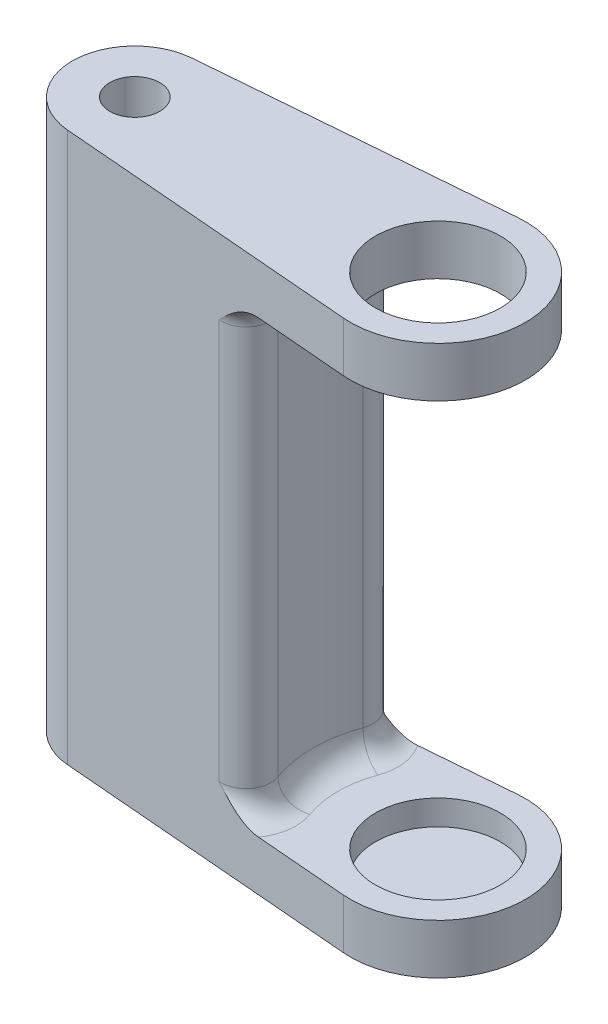
ISO-10303-21;
HEADER;
FILE_DESCRIPTION(('STEP AP214'),'2;1');
FILE_NAME('part.step','',(''),(''),'','','');
FILE_SCHEMA(('AUTOMOTIVE_DESIGN { 1 0 10303 214 1 1 1 1 }'));
ENDSEC;
DATA;
#1=APPLICATION_CONTEXT('core data for automotive mechanical design processes');
#2=APPLICATION_PROTOCOL_DEFINITION('international standard','automotive_design',2000,#1);
#3=PRODUCT_CONTEXT('',#1,'mechanical');
#4=PRODUCT('Part','Part','',(#3));
#5=PRODUCT_RELATED_PRODUCT_CATEGORY('part','',(#4));
#6=PRODUCT_DEFINITION_FORMATION('','',#4);
#7=PRODUCT_DEFINITION_CONTEXT('part definition',#1,'design');
#8=PRODUCT_DEFINITION('design','',#6,#7);
#9=PRODUCT_DEFINITION_SHAPE('','',#8);
#10=(LENGTH_UNIT() NAMED_UNIT(*) SI_UNIT(.MILLI.,.METRE.));
#11=(NAMED_UNIT(*) PLANE_ANGLE_UNIT() SI_UNIT($,.RADIAN.));
#12=(NAMED_UNIT(*) SI_UNIT($,.STERADIAN.) SOLID_ANGLE_UNIT());
#13=UNCERTAINTY_MEASURE_WITH_UNIT(LENGTH_MEASURE(1.E-05),#10,'distance_accuracy_value','');
#14=(GEOMETRIC_REPRESENTATION_CONTEXT(3) GLOBAL_UNCERTAINTY_ASSIGNED_CONTEXT((#13)) GLOBAL_UNIT_ASSIGNED_CONTEXT((#10,
#11,#12)) REPRESENTATION_CONTEXT('',''));
#15=CARTESIAN_POINT('',(0.,0.,0.));
#16=DIRECTION('',(0.,0.,1.));
#17=DIRECTION('',(1.,0.,0.));
#18=AXIS2_PLACEMENT_3D('',#15,#16,#17);
#19=CARTESIAN_POINT('',(12.1339592918151,22.,0.));
#20=DIRECTION('',(0.,-1.,0.));
#21=DIRECTION('',(0.,0.,-1.));
#22=AXIS2_PLACEMENT_3D('',#19,#20,#21);
#23=CYLINDRICAL_SURFACE('',#22,5.);
#24=DIRECTION('',(0.,-1.,0.));
#25=VECTOR('',#24,1.);
#26=CARTESIAN_POINT('',(7.43243016758423,22.,-1.70165328254865));
#27=LINE('',#26,#25);
#28=CARTESIAN_POINT('',(7.43243016758423,3.,-1.70165328254865));
#29=VERTEX_POINT('',#28);
#30=CARTESIAN_POINT('',(7.43243016758423,19.,-1.70165328254865));
#31=VERTEX_POINT('',#30);
#32=EDGE_CURVE('E302',#29,#31,#27,.F.);
#33=ORIENTED_EDGE('',*,*,#32,.T.);
#34=CARTESIAN_POINT('',(12.1339592918151,19.,0.));
#35=DIRECTION('',(0.,1.,0.));
#36=DIRECTION('',(0.,0.,1.));
#37=AXIS2_PLACEMENT_3D('',#34,#35,#36);
#38=CIRCLE('',#37,5.);
#39=CARTESIAN_POINT('',(7.43243016758423,19.,1.70165328254865));
#40=VERTEX_POINT('',#39);
#41=EDGE_CURVE('E339',#31,#40,#38,.T.);
#42=ORIENTED_EDGE('',*,*,#41,.T.);
#43=DIRECTION('',(0.,-1.,0.));
#44=VECTOR('',#43,1.);
#45=CARTESIAN_POINT('',(7.43243016758423,22.,1.70165328254865));
#46=LINE('',#45,#44);
#47=CARTESIAN_POINT('',(7.43243016758423,3.,1.70165328254865));
#48=VERTEX_POINT('',#47);
#49=EDGE_CURVE('E298',#40,#48,#46,.T.);
#50=ORIENTED_EDGE('',*,*,#49,.T.);
#51=CARTESIAN_POINT('',(12.1339592918151,3.,0.));
#52=DIRECTION('',(0.,1.,0.));
#53=DIRECTION('',(0.,0.,1.));
#54=AXIS2_PLACEMENT_3D('',#51,#52,#53);
#55=CIRCLE('',#54,5.);
#56=EDGE_CURVE('E336',#48,#29,#55,.F.);
#57=ORIENTED_EDGE('',*,*,#56,.T.);
#58=EDGE_LOOP('',(#33,#42,#50,#57));
#59=FACE_BOUND('',#58,.T.);
#60=ADVANCED_FACE('F58',(#59),#23,.F.);
#61=CARTESIAN_POINT('',(0.,2.,0.));
#62=DIRECTION('',(0.,-1.,0.));
#63=DIRECTION('',(0.,0.,-1.));
#64=AXIS2_PLACEMENT_3D('',#61,#62,#63);
#65=CYLINDRICAL_SURFACE('',#64,2.5);
#66=CARTESIAN_POINT('',(0.,0.,0.));
#67=DIRECTION('',(0.,1.,0.));
#68=DIRECTION('',(0.,0.,1.));
#69=AXIS2_PLACEMENT_3D('',#66,#67,#68);
#70=CIRCLE('',#69,2.5);
#71=CARTESIAN_POINT('',(-0.206033326787766,0.,-2.49149558864806));
#72=VERTEX_POINT('',#71);
#73=CARTESIAN_POINT('',(-0.206033326787766,0.,2.49149558864806));
#74=VERTEX_POINT('',#73);
#75=EDGE_CURVE('E264',#72,#74,#70,.T.);
#76=ORIENTED_EDGE('',*,*,#75,.T.);
#77=DIRECTION('',(0.,-1.,0.));
#78=VECTOR('',#77,1.);
#79=CARTESIAN_POINT('',(-0.206033326787766,2.,2.49149558864806));
#80=LINE('',#79,#78);
#81=CARTESIAN_POINT('',(-0.206033326787766,22.,2.49149558864806));
#82=VERTEX_POINT('',#81);
#83=EDGE_CURVE('E287',#82,#74,#80,.T.);
#84=ORIENTED_EDGE('',*,*,#83,.F.);
#85=CARTESIAN_POINT('',(0.,22.,0.));
#86=DIRECTION('',(0.,1.,0.));
#87=DIRECTION('',(0.,0.,1.));
#88=AXIS2_PLACEMENT_3D('',#85,#86,#87);
#89=CIRCLE('',#88,2.5);
#90=CARTESIAN_POINT('',(-0.206033326787766,22.,-2.49149558864806));
#91=VERTEX_POINT('',#90);
#92=EDGE_CURVE('E235',#91,#82,#89,.T.);
#93=ORIENTED_EDGE('',*,*,#92,.F.);
#94=DIRECTION('',(0.,-1.,0.));
#95=VECTOR('',#94,1.);
#96=CARTESIAN_POINT('',(-0.206033326787766,2.,-2.49149558864806));
#97=LINE('',#96,#95);
#98=EDGE_CURVE('E260',#91,#72,#97,.T.);
#99=ORIENTED_EDGE('',*,*,#98,.T.);
#100=EDGE_LOOP('',(#76,#84,#93,#99));
#101=FACE_BOUND('',#100,.T.);
#102=ADVANCED_FACE('F436',(#101),#65,.T.);
#103=CARTESIAN_POINT('',(-0.206033326787766,2.,2.49149558864806));
#104=DIRECTION('',(0.0824133307151065,0.,-0.996598235459226));
#105=DIRECTION('',(-0.996598235459226,0.,-0.0824133307151065));
#106=AXIS2_PLACEMENT_3D('',#103,#104,#105);
#107=PLANE('',#106);
#108=DIRECTION('',(0.996598235459226,0.,0.0824133307151065));
#109=VECTOR('',#108,1.);
#110=CARTESIAN_POINT('',(-0.206033326787766,2.,2.49149558864806));
#111=LINE('',#110,#109);
#112=CARTESIAN_POINT('',(8.13586979057182,2.,3.18132625053715));
#113=VERTEX_POINT('',#112);
#114=CARTESIAN_POINT('',(11.8455126343123,2.,3.48809382410729));
#115=VERTEX_POINT('',#114);
#116=EDGE_CURVE('E245',#113,#115,#111,.T.);
#117=ORIENTED_EDGE('',*,*,#116,.F.);
#118=CARTESIAN_POINT('',(8.13586979057182,2.,3.18132625053715));
#119=CARTESIAN_POINT('',(8.09316004611418,1.99999719638696,3.17779438366291));
#120=CARTESIAN_POINT('',(8.05048704833025,2.00206602766505,3.17426555554156));
#121=CARTESIAN_POINT('',(7.96556480970233,2.01007196565002,3.16724294172579));
#122=CARTESIAN_POINT('',(7.92331502317035,2.0160031855693,3.16374911090589));
#123=CARTESIAN_POINT('',(7.79858346282737,2.03899489781274,3.1534344796258));
#124=CARTESIAN_POINT('',(7.71703318744452,2.06126812700595,3.14669070909129));
#125=CARTESIAN_POINT('',(7.52853373637891,2.12790134045867,3.13110281514611));
#126=CARTESIAN_POINT('',(7.42342780321444,2.17739633549622,3.12241111800899));
#127=CARTESIAN_POINT('',(7.22184830232367,2.29230484344285,3.10574157407322));
#128=CARTESIAN_POINT('',(7.12542626618065,2.35780578217832,3.09776798866022));
#129=CARTESIAN_POINT('',(6.92168221585325,2.51342065488198,3.08091944809148));
#130=CARTESIAN_POINT('',(6.81615446108684,2.60582936815586,3.07219286856951));
#131=CARTESIAN_POINT('',(6.61179359857422,2.797324032,3.05529332094016));
#132=CARTESIAN_POINT('',(6.51295532211854,2.89640470652048,3.04711992540821));
#133=CARTESIAN_POINT('',(6.41268229349297,2.9970185776462,3.03882788356437));
#134=CARTESIAN_POINT('',(6.4111966525313,2.99850928967796,3.03870502902225));
#135=CARTESIAN_POINT('',(6.40971101202295,3.,3.03858217451761));
#136=B_SPLINE_CURVE_WITH_KNOTS('',3,(#118,#119,#120,#121,#122,#123,#124,#125,#126,#127,#128,
#129,#130,#131,#132,#133,#134,#135),.UNSPECIFIED.,.F.,.F.,(4,2,2,2,2,2,2,2,4),(0.,
0.128456249212845,0.256717171023223,0.510014180776443,0.857583473002188,1.20709540467853,
1.62797108908916,2.04851777580517,2.05484233112552),.UNSPECIFIED.);
#137=CARTESIAN_POINT('',(6.40971101202295,3.,3.03858217451761));
#138=VERTEX_POINT('',#137);
#139=EDGE_CURVE('E69',#113,#138,#136,.T.);
#140=ORIENTED_EDGE('',*,*,#139,.T.);
#141=DIRECTION('',(0.,1.,0.));
#142=VECTOR('',#141,1.);
#143=CARTESIAN_POINT('',(6.40971101202295,20.,3.03858217451761));
#144=LINE('',#143,#142);
#145=CARTESIAN_POINT('',(6.40971101202295,19.,3.03858217451761));
#146=VERTEX_POINT('',#145);
#147=EDGE_CURVE('E306',#138,#146,#144,.T.);
#148=ORIENTED_EDGE('',*,*,#147,.T.);
#149=CARTESIAN_POINT('',(8.13586979057182,20.,3.18132625053715));
#150=CARTESIAN_POINT('',(8.0931600461142,20.000002803613,3.17779438366291));
#151=CARTESIAN_POINT('',(8.05048704833028,19.9979339723349,3.17426555554157));
#152=CARTESIAN_POINT('',(7.96556480970241,19.98992803435,3.1672429417258));
#153=CARTESIAN_POINT('',(7.92331502317044,19.9839968144307,3.1637491109059));
#154=CARTESIAN_POINT('',(7.79858346282744,19.9610051021873,3.1534344796258));
#155=CARTESIAN_POINT('',(7.71703318744456,19.9387318729941,3.14669070909129));
#156=CARTESIAN_POINT('',(7.52853373637888,19.8720986595413,3.13110281514611));
#157=CARTESIAN_POINT('',(7.42342780321437,19.8226036645038,3.12241111800898));
#158=CARTESIAN_POINT('',(7.22184830232363,19.7076951565571,3.10574157407322));
#159=CARTESIAN_POINT('',(7.12542626618068,19.6421942178216,3.09776798866022));
#160=CARTESIAN_POINT('',(6.92168221585319,19.4865793451181,3.08091944809148));
#161=CARTESIAN_POINT('',(6.81615446108657,19.3941706318444,3.0721928685695));
#162=CARTESIAN_POINT('',(6.61179359857452,19.2026759679997,3.05529332094018));
#163=CARTESIAN_POINT('',(6.51295532211961,19.1035952934785,3.0471199254083));
#164=CARTESIAN_POINT('',(6.41268229349299,19.0029814223538,3.03882788356437));
#165=CARTESIAN_POINT('',(6.41119665253131,19.001490710322,3.03870502902225));
#166=CARTESIAN_POINT('',(6.40971101202295,19.,3.03858217451761));
#167=B_SPLINE_CURVE_WITH_KNOTS('',3,(#149,#150,#151,#152,#153,#154,#155,#156,#157,#158,#159,
#160,#161,#162,#163,#164,#165,#166),.UNSPECIFIED.,.F.,.F.,(4,2,2,2,2,2,2,2,4),(0.,
0.12845624921279,0.256717171023112,0.510014180776443,0.857583473002278,1.20709540467853,
1.62797108908912,2.04851777580518,2.05484233112552),.UNSPECIFIED.);
#168=CARTESIAN_POINT('',(8.13586979057182,20.,3.18132625053715));
#169=VERTEX_POINT('',#168);
#170=EDGE_CURVE('E210',#146,#169,#167,.F.);
#171=ORIENTED_EDGE('',*,*,#170,.T.);
#172=DIRECTION('',(-0.996598235459226,0.,-0.0824133307151065));
#173=VECTOR('',#172,1.);
#174=CARTESIAN_POINT('',(-0.206033326787766,20.,2.49149558864806));
#175=LINE('',#174,#173);
#176=CARTESIAN_POINT('',(11.8455126343123,20.,3.48809382410729));
#177=VERTEX_POINT('',#176);
#178=EDGE_CURVE('E205',#177,#169,#175,.T.);
#179=ORIENTED_EDGE('',*,*,#178,.F.);
#180=DIRECTION('',(0.,1.,0.));
#181=VECTOR('',#180,1.);
#182=CARTESIAN_POINT('',(11.8455126343123,20.,3.48809382410729));
#183=LINE('',#182,#181);
#184=CARTESIAN_POINT('',(11.8455126343123,22.,3.48809382410729));
#185=VERTEX_POINT('',#184);
#186=EDGE_CURVE('E189',#177,#185,#183,.T.);
#187=ORIENTED_EDGE('',*,*,#186,.T.);
#188=DIRECTION('',(0.996598235459226,0.,0.0824133307151065));
#189=VECTOR('',#188,1.);
#190=CARTESIAN_POINT('',(-0.206033326787766,22.,2.49149558864806));
#191=LINE('',#190,#189);
#192=EDGE_CURVE('E239',#82,#185,#191,.T.);
#193=ORIENTED_EDGE('',*,*,#192,.F.);
#194=ORIENTED_EDGE('',*,*,#83,.T.);
#195=DIRECTION('',(0.996598235459226,0.,0.0824133307151065));
#196=VECTOR('',#195,1.);
#197=CARTESIAN_POINT('',(-0.206033326787766,0.,2.49149558864806));
#198=LINE('',#197,#196);
#199=CARTESIAN_POINT('',(11.8455126343123,0.,3.48809382410729));
#200=VERTEX_POINT('',#199);
#201=EDGE_CURVE('E268',#74,#200,#198,.T.);
#202=ORIENTED_EDGE('',*,*,#201,.T.);
#203=DIRECTION('',(0.,-1.,0.));
#204=VECTOR('',#203,1.);
#205=CARTESIAN_POINT('',(11.8455126343123,2.,3.48809382410729));
#206=LINE('',#205,#204);
#207=EDGE_CURVE('E283',#115,#200,#206,.T.);
#208=ORIENTED_EDGE('',*,*,#207,.F.);
#209=EDGE_LOOP('',(#117,#140,#148,#171,#179,#187,#193,#194,#202,#208));
#210=FACE_BOUND('',#209,.T.);
#211=ADVANCED_FACE('F207',(#210),#107,.F.);
#212=CARTESIAN_POINT('',(12.1339592918151,2.,0.));
#213=DIRECTION('',(0.,-1.,0.));
#214=DIRECTION('',(0.,0.,-1.));
#215=AXIS2_PLACEMENT_3D('',#212,#213,#214);
#216=CYLINDRICAL_SURFACE('',#215,3.5);
#217=CARTESIAN_POINT('',(12.1339592918151,0.,0.));
#218=DIRECTION('',(0.,1.,0.));
#219=DIRECTION('',(0.,0.,1.));
#220=AXIS2_PLACEMENT_3D('',#217,#218,#219);
#221=CIRCLE('',#220,3.5);
#222=CARTESIAN_POINT('',(11.8455126343123,0.,-3.48809382410729));
#223=VERTEX_POINT('',#222);
#224=EDGE_CURVE('E271',#200,#223,#221,.T.);
#225=ORIENTED_EDGE('',*,*,#224,.T.);
#226=DIRECTION('',(0.,-1.,0.));
#227=VECTOR('',#226,1.);
#228=CARTESIAN_POINT('',(11.8455126343123,2.,-3.48809382410729));
#229=LINE('',#228,#227);
#230=CARTESIAN_POINT('',(11.8455126343123,2.,-3.48809382410729));
#231=VERTEX_POINT('',#230);
#232=EDGE_CURVE('E279',#231,#223,#229,.T.);
#233=ORIENTED_EDGE('',*,*,#232,.F.);
#234=CARTESIAN_POINT('',(12.1339592918151,2.,0.));
#235=DIRECTION('',(0.,1.,0.));
#236=DIRECTION('',(0.,0.,1.));
#237=AXIS2_PLACEMENT_3D('',#234,#235,#236);
#238=CIRCLE('',#237,3.5);
#239=EDGE_CURVE('E248',#115,#231,#238,.T.);
#240=ORIENTED_EDGE('',*,*,#239,.F.);
#241=ORIENTED_EDGE('',*,*,#207,.T.);
#242=EDGE_LOOP('',(#225,#233,#240,#241));
#243=FACE_BOUND('',#242,.T.);
#244=ADVANCED_FACE('F368',(#243),#216,.T.);
#245=CARTESIAN_POINT('',(-0.206033326787766,2.,-2.49149558864806));
#246=DIRECTION('',(-0.0824133307151065,0.,-0.996598235459226));
#247=DIRECTION('',(-0.996598235459226,0.,0.0824133307151065));
#248=AXIS2_PLACEMENT_3D('',#245,#246,#247);
#249=PLANE('',#248);
#250=DIRECTION('',(-0.996598235459226,0.,0.0824133307151065));
#251=VECTOR('',#250,1.);
#252=CARTESIAN_POINT('',(-0.206033326787766,20.,-2.49149558864806));
#253=LINE('',#252,#251);
#254=CARTESIAN_POINT('',(11.8455126343123,20.,-3.48809382410729));
#255=VERTEX_POINT('',#254);
#256=CARTESIAN_POINT('',(8.13586979057182,20.,-3.18132625053715));
#257=VERTEX_POINT('',#256);
#258=EDGE_CURVE('E202',#255,#257,#253,.T.);
#259=ORIENTED_EDGE('',*,*,#258,.T.);
#260=CARTESIAN_POINT('',(8.13586979057182,20.,-3.18132625053715));
#261=CARTESIAN_POINT('',(8.0931600461142,20.000002803613,-3.17779438366291));
#262=CARTESIAN_POINT('',(8.05048704833028,19.9979339723349,-3.17426555554157));
#263=CARTESIAN_POINT('',(7.96556480970241,19.98992803435,-3.1672429417258));
#264=CARTESIAN_POINT('',(7.92331502317044,19.9839968144307,-3.1637491109059));
#265=CARTESIAN_POINT('',(7.79858346282744,19.9610051021873,-3.1534344796258));
#266=CARTESIAN_POINT('',(7.71703318744456,19.9387318729941,-3.14669070909129));
#267=CARTESIAN_POINT('',(7.52853373637888,19.8720986595413,-3.13110281514611));
#268=CARTESIAN_POINT('',(7.42342780321437,19.8226036645038,-3.12241111800898));
#269=CARTESIAN_POINT('',(7.22184830232363,19.7076951565571,-3.10574157407322));
#270=CARTESIAN_POINT('',(7.12542626618068,19.6421942178216,-3.09776798866022));
#271=CARTESIAN_POINT('',(6.92168221585319,19.4865793451181,-3.08091944809148));
#272=CARTESIAN_POINT('',(6.81615446108657,19.3941706318444,-3.0721928685695));
#273=CARTESIAN_POINT('',(6.61179359857452,19.2026759679997,-3.05529332094018));
#274=CARTESIAN_POINT('',(6.51295532211961,19.1035952934785,-3.0471199254083));
#275=CARTESIAN_POINT('',(6.41268229349299,19.0029814223538,-3.03882788356437));
#276=CARTESIAN_POINT('',(6.41119665253131,19.001490710322,-3.03870502902225));
#277=CARTESIAN_POINT('',(6.40971101202295,19.,-3.03858217451761));
#278=B_SPLINE_CURVE_WITH_KNOTS('',3,(#260,#261,#262,#263,#264,#265,#266,#267,#268,#269,#270,
#271,#272,#273,#274,#275,#276,#277),.UNSPECIFIED.,.F.,.F.,(4,2,2,2,2,2,2,2,4),(0.,
0.12845624921279,0.256717171023112,0.510014180776443,0.857583473002278,1.20709540467853,
1.62797108908912,2.04851777580518,2.05484233112552),.UNSPECIFIED.);
#279=CARTESIAN_POINT('',(6.40971101202295,19.,-3.03858217451761));
#280=VERTEX_POINT('',#279);
#281=EDGE_CURVE('E342',#257,#280,#278,.T.);
#282=ORIENTED_EDGE('',*,*,#281,.T.);
#283=DIRECTION('',(0.,-1.,0.));
#284=VECTOR('',#283,1.);
#285=CARTESIAN_POINT('',(6.40971101202295,2.,-3.03858217451761));
#286=LINE('',#285,#284);
#287=CARTESIAN_POINT('',(6.40971101202295,3.,-3.03858217451761));
#288=VERTEX_POINT('',#287);
#289=EDGE_CURVE('E294',#280,#288,#286,.T.);
#290=ORIENTED_EDGE('',*,*,#289,.T.);
#291=CARTESIAN_POINT('',(8.13586979057182,2.,-3.18132625053715));
#292=CARTESIAN_POINT('',(8.09316004611418,1.99999719638696,-3.17779438366291));
#293=CARTESIAN_POINT('',(8.05048704833025,2.00206602766505,-3.17426555554156));
#294=CARTESIAN_POINT('',(7.96556480970233,2.01007196565002,-3.16724294172579));
#295=CARTESIAN_POINT('',(7.92331502317035,2.0160031855693,-3.16374911090589));
#296=CARTESIAN_POINT('',(7.79858346282737,2.03899489781274,-3.1534344796258));
#297=CARTESIAN_POINT('',(7.71703318744452,2.06126812700595,-3.14669070909129));
#298=CARTESIAN_POINT('',(7.52853373637891,2.12790134045867,-3.13110281514611));
#299=CARTESIAN_POINT('',(7.42342780321444,2.17739633549622,-3.12241111800899));
#300=CARTESIAN_POINT('',(7.22184830232367,2.29230484344285,-3.10574157407322));
#301=CARTESIAN_POINT('',(7.12542626618065,2.35780578217832,-3.09776798866022));
#302=CARTESIAN_POINT('',(6.92168221585325,2.51342065488198,-3.08091944809148));
#303=CARTESIAN_POINT('',(6.81615446108684,2.60582936815586,-3.07219286856951));
#304=CARTESIAN_POINT('',(6.61179359857422,2.797324032,-3.05529332094016));
#305=CARTESIAN_POINT('',(6.51295532211854,2.89640470652048,-3.04711992540821));
#306=CARTESIAN_POINT('',(6.41268229349297,2.9970185776462,-3.03882788356437));
#307=CARTESIAN_POINT('',(6.4111966525313,2.99850928967796,-3.03870502902225));
#308=CARTESIAN_POINT('',(6.40971101202295,3.,-3.03858217451761));
#309=B_SPLINE_CURVE_WITH_KNOTS('',3,(#291,#292,#293,#294,#295,#296,#297,#298,#299,#300,#301,
#302,#303,#304,#305,#306,#307,#308),.UNSPECIFIED.,.F.,.F.,(4,2,2,2,2,2,2,2,4),(0.,
0.128456249212845,0.256717171023223,0.510014180776443,0.857583473002188,1.20709540467853,
1.62797108908916,2.04851777580517,2.05484233112552),.UNSPECIFIED.);
#310=CARTESIAN_POINT('',(8.13586979057182,2.,-3.18132625053715));
#311=VERTEX_POINT('',#310);
#312=EDGE_CURVE('E12',#288,#311,#309,.F.);
#313=ORIENTED_EDGE('',*,*,#312,.T.);
#314=DIRECTION('',(0.996598235459226,0.,-0.0824133307151065));
#315=VECTOR('',#314,1.);
#316=CARTESIAN_POINT('',(-0.206033326787766,2.,-2.49149558864806));
#317=LINE('',#316,#315);
#318=EDGE_CURVE('E253',#311,#231,#317,.T.);
#319=ORIENTED_EDGE('',*,*,#318,.T.);
#320=ORIENTED_EDGE('',*,*,#232,.T.);
#321=DIRECTION('',(0.996598235459226,0.,-0.0824133307151065));
#322=VECTOR('',#321,1.);
#323=CARTESIAN_POINT('',(-0.206033326787766,0.,-2.49149558864806));
#324=LINE('',#323,#322);
#325=EDGE_CURVE('E249',#72,#223,#324,.T.);
#326=ORIENTED_EDGE('',*,*,#325,.F.);
#327=ORIENTED_EDGE('',*,*,#98,.F.);
#328=DIRECTION('',(0.996598235459226,0.,-0.0824133307151065));
#329=VECTOR('',#328,1.);
#330=CARTESIAN_POINT('',(-0.206033326787766,22.,-2.49149558864806));
#331=LINE('',#330,#329);
#332=CARTESIAN_POINT('',(11.8455126343123,22.,-3.48809382410729));
#333=VERTEX_POINT('',#332);
#334=EDGE_CURVE('E241',#91,#333,#331,.T.);
#335=ORIENTED_EDGE('',*,*,#334,.T.);
#336=DIRECTION('',(0.,1.,0.));
#337=VECTOR('',#336,1.);
#338=CARTESIAN_POINT('',(11.8455126343123,20.,-3.48809382410729));
#339=LINE('',#338,#337);
#340=EDGE_CURVE('E201',#255,#333,#339,.T.);
#341=ORIENTED_EDGE('',*,*,#340,.F.);
#342=EDGE_LOOP('',(#259,#282,#290,#313,#319,#320,#326,#327,#335,#341));
#343=FACE_BOUND('',#342,.T.);
#344=ADVANCED_FACE('F362',(#343),#249,.T.);
#345=CARTESIAN_POINT('',(0.,2.,0.));
#346=DIRECTION('',(0.,-1.,0.));
#347=DIRECTION('',(0.,0.,-1.));
#348=AXIS2_PLACEMENT_3D('',#345,#346,#347);
#349=CYLINDRICAL_SURFACE('',#348,1.);
#350=CARTESIAN_POINT('',(0.,0.,0.));
#351=DIRECTION('',(0.,1.,0.));
#352=DIRECTION('',(0.,0.,1.));
#353=AXIS2_PLACEMENT_3D('',#350,#351,#352);
#354=CIRCLE('',#353,1.);
#355=CARTESIAN_POINT('',(0.,0.,1.));
#356=VERTEX_POINT('',#355);
#357=EDGE_CURVE('E244',#356,#356,#354,.T.);
#358=ORIENTED_EDGE('',*,*,#357,.F.);
#359=EDGE_LOOP('',(#358));
#360=FACE_BOUND('',#359,.T.);
#361=CARTESIAN_POINT('',(0.,22.,0.));
#362=DIRECTION('',(0.,1.,0.));
#363=DIRECTION('',(0.,0.,1.));
#364=AXIS2_PLACEMENT_3D('',#361,#362,#363);
#365=CIRCLE('',#364,1.);
#366=CARTESIAN_POINT('',(0.,22.,1.));
#367=VERTEX_POINT('',#366);
#368=EDGE_CURVE('E230',#367,#367,#365,.T.);
#369=ORIENTED_EDGE('',*,*,#368,.T.);
#370=EDGE_LOOP('',(#369));
#371=FACE_BOUND('',#370,.T.);
#372=ADVANCED_FACE('F367',(#360,#371),#349,.F.);
#373=CARTESIAN_POINT('',(12.1339592918151,2.,0.));
#374=DIRECTION('',(0.,-1.,0.));
#375=DIRECTION('',(0.,0.,-1.));
#376=AXIS2_PLACEMENT_3D('',#373,#374,#375);
#377=CYLINDRICAL_SURFACE('',#376,2.5);
#378=CARTESIAN_POINT('',(12.1339592918151,1.,0.));
#379=DIRECTION('',(0.,1.,0.));
#380=DIRECTION('',(0.,0.,1.));
#381=AXIS2_PLACEMENT_3D('',#378,#379,#380);
#382=CIRCLE('',#381,2.5);
#383=CARTESIAN_POINT('',(12.1339592918151,1.,2.5));
#384=VERTEX_POINT('',#383);
#385=EDGE_CURVE('E290',#384,#384,#382,.T.);
#386=ORIENTED_EDGE('',*,*,#385,.F.);
#387=EDGE_LOOP('',(#386));
#388=FACE_BOUND('',#387,.T.);
#389=CARTESIAN_POINT('',(12.1339592918151,2.,0.));
#390=DIRECTION('',(0.,1.,0.));
#391=DIRECTION('',(0.,0.,1.));
#392=AXIS2_PLACEMENT_3D('',#389,#390,#391);
#393=CIRCLE('',#392,2.5);
#394=CARTESIAN_POINT('',(12.1339592918151,2.,2.5));
#395=VERTEX_POINT('',#394);
#396=EDGE_CURVE('E256',#395,#395,#393,.T.);
#397=ORIENTED_EDGE('',*,*,#396,.T.);
#398=EDGE_LOOP('',(#397));
#399=FACE_BOUND('',#398,.T.);
#400=ADVANCED_FACE('F370',(#388,#399),#377,.F.);
#401=CARTESIAN_POINT('',(0.,2.,0.));
#402=DIRECTION('',(0.,1.,0.));
#403=DIRECTION('',(0.,0.,1.));
#404=AXIS2_PLACEMENT_3D('',#401,#402,#403);
#405=PLANE('',#404);
#406=CARTESIAN_POINT('',(12.1339592918151,2.,0.));
#407=DIRECTION('',(0.,1.,0.));
#408=DIRECTION('',(0.,0.,1.));
#409=AXIS2_PLACEMENT_3D('',#406,#407,#408);
#410=CIRCLE('',#409,4.);
#411=CARTESIAN_POINT('',(8.37273599243042,2.,-1.36132262603892));
#412=VERTEX_POINT('',#411);
#413=CARTESIAN_POINT('',(8.37273599243042,2.,1.36132262603892));
#414=VERTEX_POINT('',#413);
#415=EDGE_CURVE('E80',#412,#414,#410,.T.);
#416=ORIENTED_EDGE('',*,*,#415,.T.);
#417=CARTESIAN_POINT('',(6.49212434273806,2.,2.04198393905838));
#418=DIRECTION('',(0.,1.,0.));
#419=DIRECTION('',(0.,0.,1.));
#420=AXIS2_PLACEMENT_3D('',#417,#418,#419);
#421=CIRCLE('',#420,2.);
#422=EDGE_CURVE('E333',#414,#113,#421,.F.);
#423=ORIENTED_EDGE('',*,*,#422,.T.);
#424=ORIENTED_EDGE('',*,*,#116,.T.);
#425=ORIENTED_EDGE('',*,*,#239,.T.);
#426=ORIENTED_EDGE('',*,*,#318,.F.);
#427=CARTESIAN_POINT('',(6.49212434273806,2.,-2.04198393905838));
#428=DIRECTION('',(0.,1.,0.));
#429=DIRECTION('',(0.,0.,1.));
#430=AXIS2_PLACEMENT_3D('',#427,#428,#429);
#431=CIRCLE('',#430,2.);
#432=EDGE_CURVE('E86',#311,#412,#431,.F.);
#433=ORIENTED_EDGE('',*,*,#432,.T.);
#434=EDGE_LOOP('',(#416,#423,#424,#425,#426,#433));
#435=FACE_BOUND('',#434,.T.);
#436=ORIENTED_EDGE('',*,*,#396,.F.);
#437=EDGE_LOOP('',(#436));
#438=FACE_BOUND('',#437,.T.);
#439=ADVANCED_FACE('F449',(#435,#438),#405,.T.);
#440=CARTESIAN_POINT('',(0.,0.,0.));
#441=DIRECTION('',(0.,1.,0.));
#442=DIRECTION('',(0.,0.,1.));
#443=AXIS2_PLACEMENT_3D('',#440,#441,#442);
#444=PLANE('',#443);
#445=ORIENTED_EDGE('',*,*,#224,.F.);
#446=ORIENTED_EDGE('',*,*,#201,.F.);
#447=ORIENTED_EDGE('',*,*,#75,.F.);
#448=ORIENTED_EDGE('',*,*,#325,.T.);
#449=EDGE_LOOP('',(#445,#446,#447,#448));
#450=FACE_BOUND('',#449,.T.);
#451=ORIENTED_EDGE('',*,*,#357,.T.);
#452=EDGE_LOOP('',(#451));
#453=FACE_BOUND('',#452,.T.);
#454=ADVANCED_FACE('F451',(#450,#453),#444,.F.);
#455=CARTESIAN_POINT('',(0.,22.,0.));
#456=DIRECTION('',(0.,1.,0.));
#457=DIRECTION('',(0.,0.,1.));
#458=AXIS2_PLACEMENT_3D('',#455,#456,#457);
#459=PLANE('',#458);
#460=ORIENTED_EDGE('',*,*,#368,.F.);
#461=EDGE_LOOP('',(#460));
#462=FACE_BOUND('',#461,.T.);
#463=ORIENTED_EDGE('',*,*,#92,.T.);
#464=ORIENTED_EDGE('',*,*,#192,.T.);
#465=CARTESIAN_POINT('',(12.1339592918151,22.,0.));
#466=DIRECTION('',(0.,1.,0.));
#467=DIRECTION('',(0.,0.,1.));
#468=AXIS2_PLACEMENT_3D('',#465,#466,#467);
#469=CIRCLE('',#468,3.5);
#470=EDGE_CURVE('E197',#185,#333,#469,.T.);
#471=ORIENTED_EDGE('',*,*,#470,.T.);
#472=ORIENTED_EDGE('',*,*,#334,.F.);
#473=EDGE_LOOP('',(#463,#464,#471,#472));
#474=FACE_BOUND('',#473,.T.);
#475=CARTESIAN_POINT('',(12.1339592918151,22.,0.));
#476=DIRECTION('',(0.,1.,0.));
#477=DIRECTION('',(0.,0.,1.));
#478=AXIS2_PLACEMENT_3D('',#475,#476,#477);
#479=CIRCLE('',#478,2.5);
#480=CARTESIAN_POINT('',(12.1339592918151,22.,2.5));
#481=VERTEX_POINT('',#480);
#482=EDGE_CURVE('E390',#481,#481,#479,.T.);
#483=ORIENTED_EDGE('',*,*,#482,.F.);
#484=EDGE_LOOP('',(#483));
#485=FACE_BOUND('',#484,.T.);
#486=ADVANCED_FACE('F447',(#462,#474,#485),#459,.T.);
#487=CARTESIAN_POINT('',(12.1339592918151,20.,0.));
#488=DIRECTION('',(0.,1.,0.));
#489=DIRECTION('',(0.,0.,1.));
#490=AXIS2_PLACEMENT_3D('',#487,#488,#489);
#491=CYLINDRICAL_SURFACE('',#490,3.5);
#492=ORIENTED_EDGE('',*,*,#470,.F.);
#493=ORIENTED_EDGE('',*,*,#186,.F.);
#494=CARTESIAN_POINT('',(12.1339592918151,20.,0.));
#495=DIRECTION('',(0.,1.,0.));
#496=DIRECTION('',(0.,0.,1.));
#497=AXIS2_PLACEMENT_3D('',#494,#495,#496);
#498=CIRCLE('',#497,3.5);
#499=EDGE_CURVE('E194',#177,#255,#498,.T.);
#500=ORIENTED_EDGE('',*,*,#499,.T.);
#501=ORIENTED_EDGE('',*,*,#340,.T.);
#502=EDGE_LOOP('',(#492,#493,#500,#501));
#503=FACE_BOUND('',#502,.T.);
#504=ADVANCED_FACE('F191',(#503),#491,.T.);
#505=CARTESIAN_POINT('',(12.1339592918151,20.,0.));
#506=DIRECTION('',(0.,1.,0.));
#507=DIRECTION('',(0.,0.,1.));
#508=AXIS2_PLACEMENT_3D('',#505,#506,#507);
#509=PLANE('',#508);
#510=CARTESIAN_POINT('',(12.1339592918151,20.,0.));
#511=DIRECTION('',(0.,1.,0.));
#512=DIRECTION('',(0.,0.,1.));
#513=AXIS2_PLACEMENT_3D('',#510,#511,#512);
#514=CIRCLE('',#513,2.5);
#515=CARTESIAN_POINT('',(12.1339592918151,20.,2.5));
#516=VERTEX_POINT('',#515);
#517=EDGE_CURVE('E228',#516,#516,#514,.T.);
#518=ORIENTED_EDGE('',*,*,#517,.T.);
#519=EDGE_LOOP('',(#518));
#520=FACE_BOUND('',#519,.T.);
#521=CARTESIAN_POINT('',(12.1339592918151,20.,0.));
#522=DIRECTION('',(0.,1.,0.));
#523=DIRECTION('',(0.,0.,1.));
#524=AXIS2_PLACEMENT_3D('',#521,#522,#523);
#525=CIRCLE('',#524,4.);
#526=CARTESIAN_POINT('',(8.37273599243042,20.,1.36132262603892));
#527=VERTEX_POINT('',#526);
#528=CARTESIAN_POINT('',(8.37273599243042,20.,-1.36132262603892));
#529=VERTEX_POINT('',#528);
#530=EDGE_CURVE('E309',#527,#529,#525,.F.);
#531=ORIENTED_EDGE('',*,*,#530,.T.);
#532=CARTESIAN_POINT('',(6.49212434273806,20.,-2.04198393905838));
#533=DIRECTION('',(0.,1.,0.));
#534=DIRECTION('',(0.,0.,1.));
#535=AXIS2_PLACEMENT_3D('',#532,#533,#534);
#536=CIRCLE('',#535,2.);
#537=EDGE_CURVE('E315',#529,#257,#536,.T.);
#538=ORIENTED_EDGE('',*,*,#537,.T.);
#539=ORIENTED_EDGE('',*,*,#258,.F.);
#540=ORIENTED_EDGE('',*,*,#499,.F.);
#541=ORIENTED_EDGE('',*,*,#178,.T.);
#542=CARTESIAN_POINT('',(6.49212434273806,20.,2.04198393905838));
#543=DIRECTION('',(0.,1.,0.));
#544=DIRECTION('',(0.,0.,1.));
#545=AXIS2_PLACEMENT_3D('',#542,#543,#544);
#546=CIRCLE('',#545,2.);
#547=EDGE_CURVE('E312',#169,#527,#546,.T.);
#548=ORIENTED_EDGE('',*,*,#547,.T.);
#549=EDGE_LOOP('',(#531,#538,#539,#540,#541,#548));
#550=FACE_BOUND('',#549,.T.);
#551=ADVANCED_FACE('F215',(#520,#550),#509,.F.);
#552=CARTESIAN_POINT('',(12.1339592918151,20.,0.));
#553=DIRECTION('',(0.,1.,0.));
#554=DIRECTION('',(0.,0.,1.));
#555=AXIS2_PLACEMENT_3D('',#552,#553,#554);
#556=CYLINDRICAL_SURFACE('',#555,2.5);
#557=ORIENTED_EDGE('',*,*,#517,.F.);
#558=EDGE_LOOP('',(#557));
#559=FACE_BOUND('',#558,.T.);
#560=ORIENTED_EDGE('',*,*,#482,.T.);
#561=EDGE_LOOP('',(#560));
#562=FACE_BOUND('',#561,.T.);
#563=ADVANCED_FACE('F481',(#559,#562),#556,.F.);
#564=CARTESIAN_POINT('',(0.,1.,0.));
#565=DIRECTION('',(0.,1.,0.));
#566=DIRECTION('',(0.,0.,1.));
#567=AXIS2_PLACEMENT_3D('',#564,#565,#566);
#568=PLANE('',#567);
#569=ORIENTED_EDGE('',*,*,#385,.T.);
#570=EDGE_LOOP('',(#569));
#571=FACE_BOUND('',#570,.T.);
#572=ADVANCED_FACE('F483',(#571),#568,.T.);
#573=CARTESIAN_POINT('',(6.49212434273806,22.,-2.04198393905838));
#574=DIRECTION('',(0.,-1.,0.));
#575=DIRECTION('',(0.,0.,-1.));
#576=AXIS2_PLACEMENT_3D('',#573,#574,#575);
#577=CYLINDRICAL_SURFACE('',#576,1.);
#578=ORIENTED_EDGE('',*,*,#289,.F.);
#579=CARTESIAN_POINT('',(6.49212434273806,19.,-2.04198393905838));
#580=DIRECTION('',(0.,1.,0.));
#581=DIRECTION('',(0.,0.,1.));
#582=AXIS2_PLACEMENT_3D('',#579,#580,#581);
#583=CIRCLE('',#582,1.);
#584=EDGE_CURVE('E321',#280,#31,#583,.F.);
#585=ORIENTED_EDGE('',*,*,#584,.T.);
#586=ORIENTED_EDGE('',*,*,#32,.F.);
#587=CARTESIAN_POINT('',(6.49212434273806,3.,-2.04198393905838));
#588=DIRECTION('',(0.,1.,0.));
#589=DIRECTION('',(0.,0.,1.));
#590=AXIS2_PLACEMENT_3D('',#587,#588,#589);
#591=CIRCLE('',#590,1.);
#592=EDGE_CURVE('E318',#29,#288,#591,.T.);
#593=ORIENTED_EDGE('',*,*,#592,.T.);
#594=EDGE_LOOP('',(#578,#585,#586,#593));
#595=FACE_BOUND('',#594,.T.);
#596=ADVANCED_FACE('F409',(#595),#577,.T.);
#597=CARTESIAN_POINT('',(6.49212434273806,22.,2.04198393905838));
#598=DIRECTION('',(0.,-1.,0.));
#599=DIRECTION('',(0.,0.,-1.));
#600=AXIS2_PLACEMENT_3D('',#597,#598,#599);
#601=CYLINDRICAL_SURFACE('',#600,1.);
#602=ORIENTED_EDGE('',*,*,#49,.F.);
#603=CARTESIAN_POINT('',(6.49212434273806,19.,2.04198393905838));
#604=DIRECTION('',(0.,1.,0.));
#605=DIRECTION('',(0.,0.,1.));
#606=AXIS2_PLACEMENT_3D('',#603,#604,#605);
#607=CIRCLE('',#606,1.);
#608=EDGE_CURVE('E326',#40,#146,#607,.F.);
#609=ORIENTED_EDGE('',*,*,#608,.T.);
#610=ORIENTED_EDGE('',*,*,#147,.F.);
#611=CARTESIAN_POINT('',(6.49212434273806,3.,2.04198393905838));
#612=DIRECTION('',(0.,1.,0.));
#613=DIRECTION('',(0.,0.,1.));
#614=AXIS2_PLACEMENT_3D('',#611,#612,#613);
#615=CIRCLE('',#614,1.);
#616=EDGE_CURVE('E324',#138,#48,#615,.T.);
#617=ORIENTED_EDGE('',*,*,#616,.T.);
#618=EDGE_LOOP('',(#602,#609,#610,#617));
#619=FACE_BOUND('',#618,.T.);
#620=ADVANCED_FACE('F423',(#619),#601,.T.);
#621=CARTESIAN_POINT('',(6.49212434273806,19.,2.04198393905838));
#622=DIRECTION('',(0.,1.,0.));
#623=DIRECTION('',(0.,0.,1.));
#624=AXIS2_PLACEMENT_3D('',#621,#622,#623);
#625=TOROIDAL_SURFACE('',#624,2.,1.);
#626=ORIENTED_EDGE('',*,*,#170,.F.);
#627=ORIENTED_EDGE('',*,*,#608,.F.);
#628=CARTESIAN_POINT('',(8.37273599243042,19.,1.36132262603892));
#629=DIRECTION('',(0.340330656509731,0.,0.94030582484618));
#630=DIRECTION('',(0.940305824846181,0.,-0.340330656509731));
#631=AXIS2_PLACEMENT_3D('',#628,#629,#630);
#632=CIRCLE('',#631,1.);
#633=EDGE_CURVE('E387',#527,#40,#632,.T.);
#634=ORIENTED_EDGE('',*,*,#633,.F.);
#635=ORIENTED_EDGE('',*,*,#547,.F.);
#636=EDGE_LOOP('',(#626,#627,#634,#635));
#637=FACE_BOUND('',#636,.T.);
#638=ADVANCED_FACE('F426',(#637),#625,.F.);
#639=CARTESIAN_POINT('',(12.1339592918151,19.,0.));
#640=DIRECTION('',(0.,1.,0.));
#641=DIRECTION('',(0.,0.,1.));
#642=AXIS2_PLACEMENT_3D('',#639,#640,#641);
#643=TOROIDAL_SURFACE('',#642,4.,1.);
#644=ORIENTED_EDGE('',*,*,#633,.T.);
#645=ORIENTED_EDGE('',*,*,#41,.F.);
#646=CARTESIAN_POINT('',(8.37273599243042,19.,-1.36132262603892));
#647=DIRECTION('',(-0.340330656509731,0.,0.94030582484618));
#648=DIRECTION('',(0.940305824846181,0.,0.340330656509731));
#649=AXIS2_PLACEMENT_3D('',#646,#647,#648);
#650=CIRCLE('',#649,1.);
#651=EDGE_CURVE('E383',#529,#31,#650,.T.);
#652=ORIENTED_EDGE('',*,*,#651,.F.);
#653=ORIENTED_EDGE('',*,*,#530,.F.);
#654=EDGE_LOOP('',(#644,#645,#652,#653));
#655=FACE_BOUND('',#654,.T.);
#656=ADVANCED_FACE('F418',(#655),#643,.F.);
#657=CARTESIAN_POINT('',(6.49212434273806,19.,-2.04198393905838));
#658=DIRECTION('',(0.,1.,0.));
#659=DIRECTION('',(0.,0.,1.));
#660=AXIS2_PLACEMENT_3D('',#657,#658,#659);
#661=TOROIDAL_SURFACE('',#660,2.,1.);
#662=ORIENTED_EDGE('',*,*,#651,.T.);
#663=ORIENTED_EDGE('',*,*,#584,.F.);
#664=ORIENTED_EDGE('',*,*,#281,.F.);
#665=ORIENTED_EDGE('',*,*,#537,.F.);
#666=EDGE_LOOP('',(#662,#663,#664,#665));
#667=FACE_BOUND('',#666,.T.);
#668=ADVANCED_FACE('F358',(#667),#661,.F.);
#669=CARTESIAN_POINT('',(6.49212434273806,3.,-2.04198393905838));
#670=DIRECTION('',(0.,1.,0.));
#671=DIRECTION('',(0.,0.,1.));
#672=AXIS2_PLACEMENT_3D('',#669,#670,#671);
#673=TOROIDAL_SURFACE('',#672,2.,1.);
#674=ORIENTED_EDGE('',*,*,#312,.F.);
#675=ORIENTED_EDGE('',*,*,#592,.F.);
#676=CARTESIAN_POINT('',(8.37273599243042,3.,-1.36132262603892));
#677=DIRECTION('',(0.340330656509731,0.,-0.94030582484618));
#678=DIRECTION('',(-0.94030582484618,0.,-0.340330656509731));
#679=AXIS2_PLACEMENT_3D('',#676,#677,#678);
#680=CIRCLE('',#679,1.);
#681=EDGE_CURVE('E63',#412,#29,#680,.T.);
#682=ORIENTED_EDGE('',*,*,#681,.F.);
#683=ORIENTED_EDGE('',*,*,#432,.F.);
#684=EDGE_LOOP('',(#674,#675,#682,#683));
#685=FACE_BOUND('',#684,.T.);
#686=ADVANCED_FACE('F60',(#685),#673,.F.);
#687=CARTESIAN_POINT('',(12.1339592918151,3.,0.));
#688=DIRECTION('',(0.,1.,0.));
#689=DIRECTION('',(0.,0.,1.));
#690=AXIS2_PLACEMENT_3D('',#687,#688,#689);
#691=TOROIDAL_SURFACE('',#690,4.,1.);
#692=ORIENTED_EDGE('',*,*,#681,.T.);
#693=ORIENTED_EDGE('',*,*,#56,.F.);
#694=CARTESIAN_POINT('',(8.37273599243042,3.,1.36132262603892));
#695=DIRECTION('',(-0.340330656509731,0.,-0.94030582484618));
#696=DIRECTION('',(-0.94030582484618,0.,0.340330656509731));
#697=AXIS2_PLACEMENT_3D('',#694,#695,#696);
#698=CIRCLE('',#697,1.);
#699=EDGE_CURVE('E391',#414,#48,#698,.T.);
#700=ORIENTED_EDGE('',*,*,#699,.F.);
#701=ORIENTED_EDGE('',*,*,#415,.F.);
#702=EDGE_LOOP('',(#692,#693,#700,#701));
#703=FACE_BOUND('',#702,.T.);
#704=ADVANCED_FACE('F402',(#703),#691,.F.);
#705=CARTESIAN_POINT('',(6.49212434273806,3.,2.04198393905838));
#706=DIRECTION('',(0.,1.,0.));
#707=DIRECTION('',(0.,0.,1.));
#708=AXIS2_PLACEMENT_3D('',#705,#706,#707);
#709=TOROIDAL_SURFACE('',#708,2.,1.);
#710=ORIENTED_EDGE('',*,*,#699,.T.);
#711=ORIENTED_EDGE('',*,*,#616,.F.);
#712=ORIENTED_EDGE('',*,*,#139,.F.);
#713=ORIENTED_EDGE('',*,*,#422,.F.);
#714=EDGE_LOOP('',(#710,#711,#712,#713));
#715=FACE_BOUND('',#714,.T.);
#716=ADVANCED_FACE('F429',(#715),#709,.F.);
#717=CLOSED_SHELL('',(#60,#102,#211,#244,#344,#372,#400,#439,#454,#486,#504,#551,#563,#572,#596,
#620,#638,#656,#668,#686,#704,#716));
#718=MANIFOLD_SOLID_BREP('B2',#717);
#719=ADVANCED_BREP_SHAPE_REPRESENTATION('',(#18,#718),#14);
#720=SHAPE_DEFINITION_REPRESENTATION(#9,#719);
ENDSEC;
END-ISO-10303-21;
